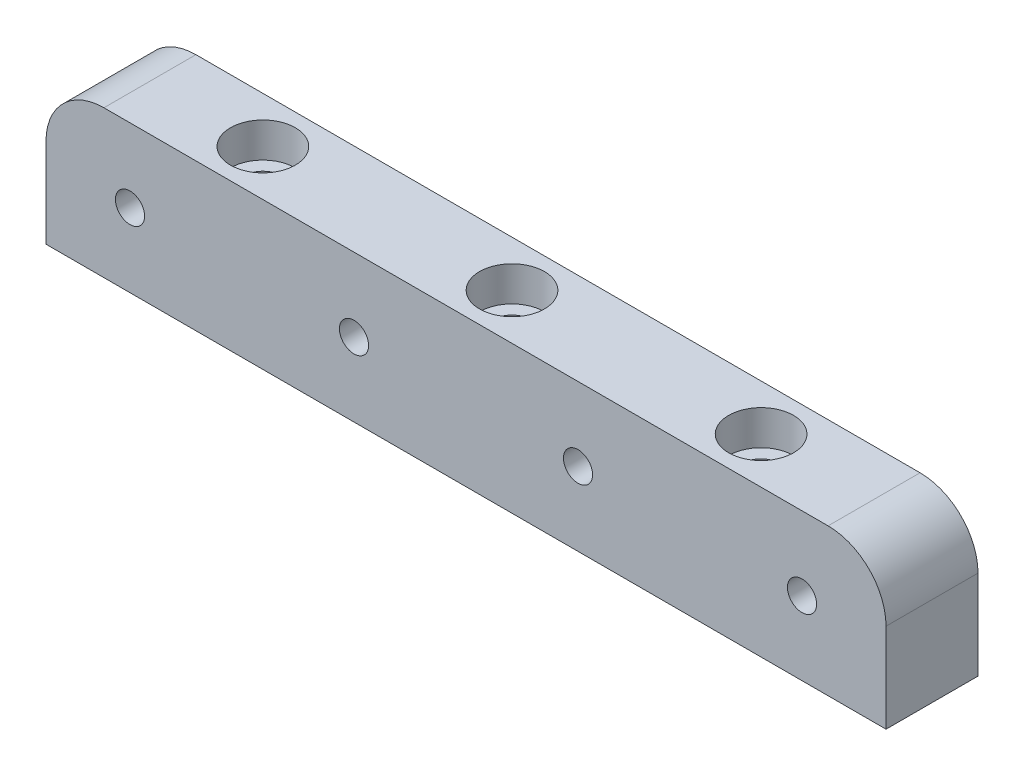
ISO-10303-21;
HEADER;
FILE_DESCRIPTION(('STEP AP214'),'2;1');
FILE_NAME('part.step','',(''),(''),'','','');
FILE_SCHEMA(('AUTOMOTIVE_DESIGN { 1 0 10303 214 1 1 1 1 }'));
ENDSEC;
DATA;
#1=APPLICATION_CONTEXT('core data for automotive mechanical design processes');
#2=APPLICATION_PROTOCOL_DEFINITION('international standard','automotive_design',2000,#1);
#3=PRODUCT_CONTEXT('',#1,'mechanical');
#4=PRODUCT('Part','Part','',(#3));
#5=PRODUCT_RELATED_PRODUCT_CATEGORY('part','',(#4));
#6=PRODUCT_DEFINITION_FORMATION('','',#4);
#7=PRODUCT_DEFINITION_CONTEXT('part definition',#1,'design');
#8=PRODUCT_DEFINITION('design','',#6,#7);
#9=PRODUCT_DEFINITION_SHAPE('','',#8);
#10=(LENGTH_UNIT() NAMED_UNIT(*) SI_UNIT(.MILLI.,.METRE.));
#11=(NAMED_UNIT(*) PLANE_ANGLE_UNIT() SI_UNIT($,.RADIAN.));
#12=(NAMED_UNIT(*) SI_UNIT($,.STERADIAN.) SOLID_ANGLE_UNIT());
#13=UNCERTAINTY_MEASURE_WITH_UNIT(LENGTH_MEASURE(1.E-05),#10,'distance_accuracy_value','');
#14=(GEOMETRIC_REPRESENTATION_CONTEXT(3) GLOBAL_UNCERTAINTY_ASSIGNED_CONTEXT((#13)) GLOBAL_UNIT_ASSIGNED_CONTEXT((#10,
#11,#12)) REPRESENTATION_CONTEXT('',''));
#15=CARTESIAN_POINT('',(0.,0.,0.));
#16=DIRECTION('',(0.,0.,1.));
#17=DIRECTION('',(1.,0.,0.));
#18=AXIS2_PLACEMENT_3D('',#15,#16,#17);
#19=CARTESIAN_POINT('',(0.,160.205737679692,31.6012401673979));
#20=DIRECTION('',(1.,0.,0.));
#21=DIRECTION('',(0.,1.,0.));
#22=AXIS2_PLACEMENT_3D('',#19,#20,#21);
#23=PLANE('',#22);
#24=DIRECTION('',(0.,0.,1.));
#25=VECTOR('',#24,1.);
#26=CARTESIAN_POINT('',(0.,162.905737679692,27.6324901673979));
#27=LINE('',#26,#25);
#28=CARTESIAN_POINT('',(0.,162.905737679692,23.6637401673979));
#29=VERTEX_POINT('',#28);
#30=CARTESIAN_POINT('',(0.,162.905737679692,39.5387401673979));
#31=VERTEX_POINT('',#30);
#32=EDGE_CURVE('E184',#29,#31,#27,.T.);
#33=ORIENTED_EDGE('',*,*,#32,.F.);
#34=DIRECTION('',(0.,-1.,0.));
#35=VECTOR('',#34,1.);
#36=CARTESIAN_POINT('',(0.,172.905737679692,23.6637401673979));
#37=LINE('',#36,#35);
#38=CARTESIAN_POINT('',(0.,147.505737679692,23.6637401673979));
#39=VERTEX_POINT('',#38);
#40=EDGE_CURVE('E11',#29,#39,#37,.T.);
#41=ORIENTED_EDGE('',*,*,#40,.T.);
#42=DIRECTION('',(0.,0.,1.));
#43=VECTOR('',#42,1.);
#44=CARTESIAN_POINT('',(0.,147.505737679692,23.6637401673979));
#45=LINE('',#44,#43);
#46=CARTESIAN_POINT('',(0.,147.505737679692,39.5387401673979));
#47=VERTEX_POINT('',#46);
#48=EDGE_CURVE('E112',#39,#47,#45,.T.);
#49=ORIENTED_EDGE('',*,*,#48,.T.);
#50=DIRECTION('',(0.,1.,0.));
#51=VECTOR('',#50,1.);
#52=CARTESIAN_POINT('',(0.,147.505737679692,39.5387401673979));
#53=LINE('',#52,#51);
#54=EDGE_CURVE('E105',#47,#31,#53,.T.);
#55=ORIENTED_EDGE('',*,*,#54,.T.);
#56=EDGE_LOOP('',(#33,#41,#49,#55));
#57=FACE_BOUND('',#56,.T.);
#58=ADVANCED_FACE('F17',(#57),#23,.F.);
#59=CARTESIAN_POINT('',(0.,147.505737679692,23.6637401673979));
#60=DIRECTION('',(0.,0.,-1.));
#61=DIRECTION('',(0.,-1.,0.));
#62=AXIS2_PLACEMENT_3D('',#59,#60,#61);
#63=PLANE('',#62);
#64=CARTESIAN_POINT('',(130.5,160.205737679692,23.6637401673979));
#65=DIRECTION('',(0.,0.,1.));
#66=DIRECTION('',(1.,0.,0.));
#67=AXIS2_PLACEMENT_3D('',#64,#65,#66);
#68=CIRCLE('',#67,2.5175);
#69=CARTESIAN_POINT('',(127.9825,160.205737679692,23.6637401673979));
#70=VERTEX_POINT('',#69);
#71=EDGE_CURVE('E316',#70,#70,#68,.T.);
#72=ORIENTED_EDGE('',*,*,#71,.T.);
#73=EDGE_LOOP('',(#72));
#74=FACE_BOUND('',#73,.T.);
#75=CARTESIAN_POINT('',(91.8333333333333,160.205737679692,23.6637401673979));
#76=DIRECTION('',(0.,0.,1.));
#77=DIRECTION('',(1.,0.,0.));
#78=AXIS2_PLACEMENT_3D('',#75,#76,#77);
#79=CIRCLE('',#78,2.5175);
#80=CARTESIAN_POINT('',(89.3158333333333,160.205737679692,23.6637401673979));
#81=VERTEX_POINT('',#80);
#82=EDGE_CURVE('E338',#81,#81,#79,.T.);
#83=ORIENTED_EDGE('',*,*,#82,.T.);
#84=EDGE_LOOP('',(#83));
#85=FACE_BOUND('',#84,.T.);
#86=CARTESIAN_POINT('',(53.1666666666667,160.205737679692,23.6637401673979));
#87=DIRECTION('',(0.,0.,1.));
#88=DIRECTION('',(1.,0.,0.));
#89=AXIS2_PLACEMENT_3D('',#86,#87,#88);
#90=CIRCLE('',#89,2.5175);
#91=CARTESIAN_POINT('',(50.6491666666667,160.205737679692,23.6637401673979));
#92=VERTEX_POINT('',#91);
#93=EDGE_CURVE('E362',#92,#92,#90,.T.);
#94=ORIENTED_EDGE('',*,*,#93,.T.);
#95=EDGE_LOOP('',(#94));
#96=FACE_BOUND('',#95,.T.);
#97=CARTESIAN_POINT('',(14.5,160.205737679692,23.6637401673979));
#98=DIRECTION('',(0.,0.,1.));
#99=DIRECTION('',(1.,0.,0.));
#100=AXIS2_PLACEMENT_3D('',#97,#98,#99);
#101=CIRCLE('',#100,2.5175);
#102=CARTESIAN_POINT('',(11.9825,160.205737679692,23.6637401673979));
#103=VERTEX_POINT('',#102);
#104=EDGE_CURVE('E381',#103,#103,#101,.T.);
#105=ORIENTED_EDGE('',*,*,#104,.T.);
#106=EDGE_LOOP('',(#105));
#107=FACE_BOUND('',#106,.T.);
#108=CARTESIAN_POINT('',(10.,162.905737679692,23.6637401673979));
#109=DIRECTION('',(0.,0.,1.));
#110=DIRECTION('',(-0.707106781186548,0.707106781186548,0.));
#111=AXIS2_PLACEMENT_3D('',#108,#109,#110);
#112=CIRCLE('',#111,10.);
#113=CARTESIAN_POINT('',(10.,172.905737679692,23.6637401673979));
#114=VERTEX_POINT('',#113);
#115=EDGE_CURVE('E195',#114,#29,#112,.T.);
#116=ORIENTED_EDGE('',*,*,#115,.F.);
#117=DIRECTION('',(1.,0.,0.));
#118=VECTOR('',#117,1.);
#119=CARTESIAN_POINT('',(0.,172.905737679692,23.6637401673979));
#120=LINE('',#119,#118);
#121=CARTESIAN_POINT('',(135.,172.905737679692,23.6637401673979));
#122=VERTEX_POINT('',#121);
#123=EDGE_CURVE('E152',#114,#122,#120,.T.);
#124=ORIENTED_EDGE('',*,*,#123,.T.);
#125=CARTESIAN_POINT('',(135.,162.905737679692,23.6637401673979));
#126=DIRECTION('',(0.,0.,1.));
#127=DIRECTION('',(0.707106781186548,0.707106781186548,0.));
#128=AXIS2_PLACEMENT_3D('',#125,#126,#127);
#129=CIRCLE('',#128,10.);
#130=CARTESIAN_POINT('',(145.,162.905737679692,23.6637401673979));
#131=VERTEX_POINT('',#130);
#132=EDGE_CURVE('E80',#131,#122,#129,.T.);
#133=ORIENTED_EDGE('',*,*,#132,.F.);
#134=DIRECTION('',(0.,1.,0.));
#135=VECTOR('',#134,1.);
#136=CARTESIAN_POINT('',(145.,172.905737679692,23.6637401673979));
#137=LINE('',#136,#135);
#138=CARTESIAN_POINT('',(145.,147.505737679692,23.6637401673979));
#139=VERTEX_POINT('',#138);
#140=EDGE_CURVE('E71',#139,#131,#137,.T.);
#141=ORIENTED_EDGE('',*,*,#140,.F.);
#142=DIRECTION('',(1.,0.,0.));
#143=VECTOR('',#142,1.);
#144=CARTESIAN_POINT('',(0.,147.505737679692,23.6637401673979));
#145=LINE('',#144,#143);
#146=EDGE_CURVE('E25',#39,#139,#145,.T.);
#147=ORIENTED_EDGE('',*,*,#146,.F.);
#148=ORIENTED_EDGE('',*,*,#40,.F.);
#149=EDGE_LOOP('',(#116,#124,#133,#141,#147,#148));
#150=FACE_BOUND('',#149,.T.);
#151=ADVANCED_FACE('F447',(#74,#85,#96,#107,#150),#63,.T.);
#152=CARTESIAN_POINT('',(0.,147.505737679692,39.5387401673979));
#153=DIRECTION('',(0.,-1.,0.));
#154=DIRECTION('',(0.,0.,-1.));
#155=AXIS2_PLACEMENT_3D('',#152,#153,#154);
#156=PLANE('',#155);
#157=CARTESIAN_POINT('',(72.5,147.505737679692,31.6012401673979));
#158=DIRECTION('',(0.,1.,0.));
#159=DIRECTION('',(0.,0.,1.));
#160=AXIS2_PLACEMENT_3D('',#157,#158,#159);
#161=CIRCLE('',#160,3.25);
#162=CARTESIAN_POINT('',(72.5,147.505737679692,28.3512401673979));
#163=VERTEX_POINT('',#162);
#164=EDGE_CURVE('E200',#163,#163,#161,.T.);
#165=ORIENTED_EDGE('',*,*,#164,.T.);
#166=EDGE_LOOP('',(#165));
#167=FACE_BOUND('',#166,.T.);
#168=CARTESIAN_POINT('',(29.5,147.505737679692,31.6012401673979));
#169=DIRECTION('',(0.,1.,0.));
#170=DIRECTION('',(0.,0.,1.));
#171=AXIS2_PLACEMENT_3D('',#168,#169,#170);
#172=CIRCLE('',#171,3.25);
#173=CARTESIAN_POINT('',(29.5,147.505737679692,28.3512401673979));
#174=VERTEX_POINT('',#173);
#175=EDGE_CURVE('E241',#174,#174,#172,.T.);
#176=ORIENTED_EDGE('',*,*,#175,.T.);
#177=EDGE_LOOP('',(#176));
#178=FACE_BOUND('',#177,.T.);
#179=CARTESIAN_POINT('',(115.5,147.505737679692,31.6012401673979));
#180=DIRECTION('',(0.,1.,0.));
#181=DIRECTION('',(0.,0.,1.));
#182=AXIS2_PLACEMENT_3D('',#179,#180,#181);
#183=CIRCLE('',#182,3.25);
#184=CARTESIAN_POINT('',(115.5,147.505737679692,28.3512401673979));
#185=VERTEX_POINT('',#184);
#186=EDGE_CURVE('E279',#185,#185,#183,.T.);
#187=ORIENTED_EDGE('',*,*,#186,.T.);
#188=EDGE_LOOP('',(#187));
#189=FACE_BOUND('',#188,.T.);
#190=ORIENTED_EDGE('',*,*,#48,.F.);
#191=ORIENTED_EDGE('',*,*,#146,.T.);
#192=DIRECTION('',(0.,0.,-1.));
#193=VECTOR('',#192,1.);
#194=CARTESIAN_POINT('',(145.,147.505737679692,23.6637401673979));
#195=LINE('',#194,#193);
#196=CARTESIAN_POINT('',(145.,147.505737679692,39.5387401673979));
#197=VERTEX_POINT('',#196);
#198=EDGE_CURVE('E107',#197,#139,#195,.T.);
#199=ORIENTED_EDGE('',*,*,#198,.F.);
#200=DIRECTION('',(1.,0.,0.));
#201=VECTOR('',#200,1.);
#202=CARTESIAN_POINT('',(0.,147.505737679692,39.5387401673979));
#203=LINE('',#202,#201);
#204=EDGE_CURVE('E92',#47,#197,#203,.T.);
#205=ORIENTED_EDGE('',*,*,#204,.F.);
#206=EDGE_LOOP('',(#190,#191,#199,#205));
#207=FACE_BOUND('',#206,.T.);
#208=ADVANCED_FACE('F455',(#167,#178,#189,#207),#156,.T.);
#209=CARTESIAN_POINT('',(145.,160.205737679692,31.6012401673979));
#210=DIRECTION('',(1.,0.,0.));
#211=DIRECTION('',(0.,1.,0.));
#212=AXIS2_PLACEMENT_3D('',#209,#210,#211);
#213=PLANE('',#212);
#214=DIRECTION('',(0.,0.,-1.));
#215=VECTOR('',#214,1.);
#216=CARTESIAN_POINT('',(145.,162.905737679692,27.6324901673979));
#217=LINE('',#216,#215);
#218=CARTESIAN_POINT('',(145.,162.905737679692,39.5387401673979));
#219=VERTEX_POINT('',#218);
#220=EDGE_CURVE('E65',#219,#131,#217,.T.);
#221=ORIENTED_EDGE('',*,*,#220,.F.);
#222=DIRECTION('',(0.,-1.,0.));
#223=VECTOR('',#222,1.);
#224=CARTESIAN_POINT('',(145.,147.505737679692,39.5387401673979));
#225=LINE('',#224,#223);
#226=EDGE_CURVE('E69',#219,#197,#225,.T.);
#227=ORIENTED_EDGE('',*,*,#226,.T.);
#228=ORIENTED_EDGE('',*,*,#198,.T.);
#229=ORIENTED_EDGE('',*,*,#140,.T.);
#230=EDGE_LOOP('',(#221,#227,#228,#229));
#231=FACE_BOUND('',#230,.T.);
#232=ADVANCED_FACE('F70',(#231),#213,.T.);
#233=CARTESIAN_POINT('',(135.,162.905737679692,27.6324901673979));
#234=DIRECTION('',(0.,0.,1.));
#235=DIRECTION('',(0.707106781186548,0.707106781186548,0.));
#236=AXIS2_PLACEMENT_3D('',#233,#234,#235);
#237=CYLINDRICAL_SURFACE('',#236,10.);
#238=CARTESIAN_POINT('',(135.,162.905737679692,39.5387401673979));
#239=DIRECTION('',(0.,0.,-1.));
#240=DIRECTION('',(0.707106781186548,0.707106781186548,0.));
#241=AXIS2_PLACEMENT_3D('',#238,#239,#240);
#242=CIRCLE('',#241,10.);
#243=CARTESIAN_POINT('',(135.,172.905737679692,39.5387401673979));
#244=VERTEX_POINT('',#243);
#245=EDGE_CURVE('E77',#244,#219,#242,.T.);
#246=ORIENTED_EDGE('',*,*,#245,.T.);
#247=ORIENTED_EDGE('',*,*,#220,.T.);
#248=ORIENTED_EDGE('',*,*,#132,.T.);
#249=DIRECTION('',(0.,0.,1.));
#250=VECTOR('',#249,1.);
#251=CARTESIAN_POINT('',(135.,172.905737679692,27.6324901673979));
#252=LINE('',#251,#250);
#253=EDGE_CURVE('E84',#122,#244,#252,.T.);
#254=ORIENTED_EDGE('',*,*,#253,.T.);
#255=EDGE_LOOP('',(#246,#247,#248,#254));
#256=FACE_BOUND('',#255,.T.);
#257=ADVANCED_FACE('F85',(#256),#237,.T.);
#258=CARTESIAN_POINT('',(0.,172.905737679692,39.5387401673979));
#259=DIRECTION('',(0.,0.,1.));
#260=DIRECTION('',(1.,0.,0.));
#261=AXIS2_PLACEMENT_3D('',#258,#259,#260);
#262=PLANE('',#261);
#263=CARTESIAN_POINT('',(130.5,160.205737679692,39.5387401673979));
#264=DIRECTION('',(0.,0.,-1.));
#265=DIRECTION('',(1.,0.,0.));
#266=AXIS2_PLACEMENT_3D('',#263,#264,#265);
#267=CIRCLE('',#266,2.5175);
#268=CARTESIAN_POINT('',(127.9825,160.205737679692,39.5387401673979));
#269=VERTEX_POINT('',#268);
#270=EDGE_CURVE('E335',#269,#269,#267,.T.);
#271=ORIENTED_EDGE('',*,*,#270,.T.);
#272=EDGE_LOOP('',(#271));
#273=FACE_BOUND('',#272,.T.);
#274=CARTESIAN_POINT('',(91.8333333333333,160.205737679692,39.5387401673979));
#275=DIRECTION('',(0.,0.,-1.));
#276=DIRECTION('',(1.,0.,0.));
#277=AXIS2_PLACEMENT_3D('',#274,#275,#276);
#278=CIRCLE('',#277,2.5175);
#279=CARTESIAN_POINT('',(89.3158333333333,160.205737679692,39.5387401673979));
#280=VERTEX_POINT('',#279);
#281=EDGE_CURVE('E354',#280,#280,#278,.T.);
#282=ORIENTED_EDGE('',*,*,#281,.T.);
#283=EDGE_LOOP('',(#282));
#284=FACE_BOUND('',#283,.T.);
#285=CARTESIAN_POINT('',(53.1666666666667,160.205737679692,39.5387401673979));
#286=DIRECTION('',(0.,0.,-1.));
#287=DIRECTION('',(1.,0.,0.));
#288=AXIS2_PLACEMENT_3D('',#285,#286,#287);
#289=CIRCLE('',#288,2.5175);
#290=CARTESIAN_POINT('',(50.6491666666667,160.205737679692,39.5387401673979));
#291=VERTEX_POINT('',#290);
#292=EDGE_CURVE('E374',#291,#291,#289,.T.);
#293=ORIENTED_EDGE('',*,*,#292,.T.);
#294=EDGE_LOOP('',(#293));
#295=FACE_BOUND('',#294,.T.);
#296=CARTESIAN_POINT('',(14.5,160.205737679692,39.5387401673979));
#297=DIRECTION('',(0.,0.,-1.));
#298=DIRECTION('',(1.,0.,0.));
#299=AXIS2_PLACEMENT_3D('',#296,#297,#298);
#300=CIRCLE('',#299,2.5175);
#301=CARTESIAN_POINT('',(11.9825,160.205737679692,39.5387401673979));
#302=VERTEX_POINT('',#301);
#303=EDGE_CURVE('E394',#302,#302,#300,.T.);
#304=ORIENTED_EDGE('',*,*,#303,.T.);
#305=EDGE_LOOP('',(#304));
#306=FACE_BOUND('',#305,.T.);
#307=CARTESIAN_POINT('',(10.,162.905737679692,39.5387401673979));
#308=DIRECTION('',(0.,0.,-1.));
#309=DIRECTION('',(-0.707106781186548,0.707106781186548,0.));
#310=AXIS2_PLACEMENT_3D('',#307,#308,#309);
#311=CIRCLE('',#310,10.);
#312=CARTESIAN_POINT('',(10.,172.905737679692,39.5387401673979));
#313=VERTEX_POINT('',#312);
#314=EDGE_CURVE('E178',#31,#313,#311,.T.);
#315=ORIENTED_EDGE('',*,*,#314,.F.);
#316=ORIENTED_EDGE('',*,*,#54,.F.);
#317=ORIENTED_EDGE('',*,*,#204,.T.);
#318=ORIENTED_EDGE('',*,*,#226,.F.);
#319=ORIENTED_EDGE('',*,*,#245,.F.);
#320=DIRECTION('',(1.,0.,0.));
#321=VECTOR('',#320,1.);
#322=CARTESIAN_POINT('',(0.,172.905737679692,39.5387401673979));
#323=LINE('',#322,#321);
#324=EDGE_CURVE('E164',#313,#244,#323,.T.);
#325=ORIENTED_EDGE('',*,*,#324,.F.);
#326=EDGE_LOOP('',(#315,#316,#317,#318,#319,#325));
#327=FACE_BOUND('',#326,.T.);
#328=ADVANCED_FACE('F95',(#273,#284,#295,#306,#327),#262,.T.);
#329=CARTESIAN_POINT('',(0.,172.905737679692,23.6637401673979));
#330=DIRECTION('',(0.,1.,0.));
#331=DIRECTION('',(1.,0.,0.));
#332=AXIS2_PLACEMENT_3D('',#329,#330,#331);
#333=PLANE('',#332);
#334=CARTESIAN_POINT('',(72.5,172.905737679692,31.6012401673979));
#335=DIRECTION('',(0.,-1.,0.));
#336=DIRECTION('',(0.,0.,1.));
#337=AXIS2_PLACEMENT_3D('',#334,#335,#336);
#338=CIRCLE('',#337,5.6);
#339=CARTESIAN_POINT('',(72.5,172.905737679692,26.0012401673979));
#340=VERTEX_POINT('',#339);
#341=EDGE_CURVE('E219',#340,#340,#338,.T.);
#342=ORIENTED_EDGE('',*,*,#341,.T.);
#343=EDGE_LOOP('',(#342));
#344=FACE_BOUND('',#343,.T.);
#345=CARTESIAN_POINT('',(29.5,172.905737679692,31.6012401673979));
#346=DIRECTION('',(0.,-1.,0.));
#347=DIRECTION('',(0.,0.,1.));
#348=AXIS2_PLACEMENT_3D('',#345,#346,#347);
#349=CIRCLE('',#348,5.6);
#350=CARTESIAN_POINT('',(29.5,172.905737679692,26.0012401673979));
#351=VERTEX_POINT('',#350);
#352=EDGE_CURVE('E259',#351,#351,#349,.T.);
#353=ORIENTED_EDGE('',*,*,#352,.T.);
#354=EDGE_LOOP('',(#353));
#355=FACE_BOUND('',#354,.T.);
#356=CARTESIAN_POINT('',(115.5,172.905737679692,31.6012401673979));
#357=DIRECTION('',(0.,-1.,0.));
#358=DIRECTION('',(0.,0.,1.));
#359=AXIS2_PLACEMENT_3D('',#356,#357,#358);
#360=CIRCLE('',#359,5.6);
#361=CARTESIAN_POINT('',(115.5,172.905737679692,26.0012401673979));
#362=VERTEX_POINT('',#361);
#363=EDGE_CURVE('E297',#362,#362,#360,.T.);
#364=ORIENTED_EDGE('',*,*,#363,.T.);
#365=EDGE_LOOP('',(#364));
#366=FACE_BOUND('',#365,.T.);
#367=DIRECTION('',(0.,0.,-1.));
#368=VECTOR('',#367,1.);
#369=CARTESIAN_POINT('',(10.,172.905737679692,27.6324901673979));
#370=LINE('',#369,#368);
#371=EDGE_CURVE('E171',#313,#114,#370,.T.);
#372=ORIENTED_EDGE('',*,*,#371,.F.);
#373=ORIENTED_EDGE('',*,*,#324,.T.);
#374=ORIENTED_EDGE('',*,*,#253,.F.);
#375=ORIENTED_EDGE('',*,*,#123,.F.);
#376=EDGE_LOOP('',(#372,#373,#374,#375));
#377=FACE_BOUND('',#376,.T.);
#378=ADVANCED_FACE('F412',(#344,#355,#366,#377),#333,.T.);
#379=CARTESIAN_POINT('',(10.,162.905737679692,27.6324901673979));
#380=DIRECTION('',(0.,0.,-1.));
#381=DIRECTION('',(-0.707106781186548,0.707106781186548,0.));
#382=AXIS2_PLACEMENT_3D('',#379,#380,#381);
#383=CYLINDRICAL_SURFACE('',#382,10.);
#384=ORIENTED_EDGE('',*,*,#115,.T.);
#385=ORIENTED_EDGE('',*,*,#32,.T.);
#386=ORIENTED_EDGE('',*,*,#314,.T.);
#387=ORIENTED_EDGE('',*,*,#371,.T.);
#388=EDGE_LOOP('',(#384,#385,#386,#387));
#389=FACE_BOUND('',#388,.T.);
#390=ADVANCED_FACE('F461',(#389),#383,.T.);
#391=CARTESIAN_POINT('',(72.5,160.205737679692,31.6012401673979));
#392=DIRECTION('',(0.,-1.,0.));
#393=DIRECTION('',(0.,0.,1.));
#394=AXIS2_PLACEMENT_3D('',#391,#392,#393);
#395=CYLINDRICAL_SURFACE('',#394,3.25);
#396=CARTESIAN_POINT('',(72.5,166.905737679692,31.6012401673979));
#397=DIRECTION('',(0.,-1.,0.));
#398=DIRECTION('',(0.,0.,1.));
#399=AXIS2_PLACEMENT_3D('',#396,#397,#398);
#400=CIRCLE('',#399,3.25);
#401=CARTESIAN_POINT('',(72.5,166.905737679692,28.3512401673979));
#402=VERTEX_POINT('',#401);
#403=EDGE_CURVE('E227',#402,#402,#400,.T.);
#404=ORIENTED_EDGE('',*,*,#403,.F.);
#405=DIRECTION('',(0.,-1.,0.));
#406=VECTOR('',#405,1.);
#407=CARTESIAN_POINT('',(72.5,160.205737679692,28.3512401673979));
#408=LINE('',#407,#406);
#409=EDGE_CURVE('E206',#402,#163,#408,.T.);
#410=ORIENTED_EDGE('',*,*,#409,.T.);
#411=ORIENTED_EDGE('',*,*,#164,.F.);
#412=ORIENTED_EDGE('',*,*,#409,.F.);
#413=EDGE_LOOP('',(#404,#410,#411,#412));
#414=FACE_BOUND('',#413,.T.);
#415=ADVANCED_FACE('F583',(#414),#395,.F.);
#416=CARTESIAN_POINT('',(72.5,169.905737679692,31.6012401673979));
#417=DIRECTION('',(0.,-1.,0.));
#418=DIRECTION('',(0.,0.,1.));
#419=AXIS2_PLACEMENT_3D('',#416,#417,#418);
#420=CYLINDRICAL_SURFACE('',#419,5.6);
#421=ORIENTED_EDGE('',*,*,#341,.F.);
#422=DIRECTION('',(0.,-1.,0.));
#423=VECTOR('',#422,1.);
#424=CARTESIAN_POINT('',(72.5,169.905737679692,26.0012401673979));
#425=LINE('',#424,#423);
#426=CARTESIAN_POINT('',(72.5,166.905737679692,26.0012401673979));
#427=VERTEX_POINT('',#426);
#428=EDGE_CURVE('E213',#340,#427,#425,.T.);
#429=ORIENTED_EDGE('',*,*,#428,.T.);
#430=CARTESIAN_POINT('',(72.5,166.905737679692,31.6012401673979));
#431=DIRECTION('',(0.,-1.,0.));
#432=DIRECTION('',(0.,0.,1.));
#433=AXIS2_PLACEMENT_3D('',#430,#431,#432);
#434=CIRCLE('',#433,5.6);
#435=EDGE_CURVE('E232',#427,#427,#434,.T.);
#436=ORIENTED_EDGE('',*,*,#435,.T.);
#437=ORIENTED_EDGE('',*,*,#428,.F.);
#438=EDGE_LOOP('',(#421,#429,#436,#437));
#439=FACE_BOUND('',#438,.T.);
#440=ADVANCED_FACE('F581',(#439),#420,.F.);
#441=CARTESIAN_POINT('',(72.5,166.905737679692,31.6012401673979));
#442=DIRECTION('',(0.,-1.,0.));
#443=DIRECTION('',(0.,0.,-1.));
#444=AXIS2_PLACEMENT_3D('',#441,#442,#443);
#445=PLANE('',#444);
#446=ORIENTED_EDGE('',*,*,#403,.T.);
#447=EDGE_LOOP('',(#446));
#448=FACE_BOUND('',#447,.T.);
#449=ORIENTED_EDGE('',*,*,#435,.F.);
#450=EDGE_LOOP('',(#449));
#451=FACE_BOUND('',#450,.T.);
#452=ADVANCED_FACE('F589',(#448,#451),#445,.F.);
#453=CARTESIAN_POINT('',(29.5,160.205737679692,31.6012401673979));
#454=DIRECTION('',(0.,-1.,0.));
#455=DIRECTION('',(0.,0.,1.));
#456=AXIS2_PLACEMENT_3D('',#453,#454,#455);
#457=CYLINDRICAL_SURFACE('',#456,3.25);
#458=CARTESIAN_POINT('',(29.5,166.905737679692,31.6012401673979));
#459=DIRECTION('',(0.,-1.,0.));
#460=DIRECTION('',(0.,0.,1.));
#461=AXIS2_PLACEMENT_3D('',#458,#459,#460);
#462=CIRCLE('',#461,3.25);
#463=CARTESIAN_POINT('',(29.5,166.905737679692,28.3512401673979));
#464=VERTEX_POINT('',#463);
#465=EDGE_CURVE('E262',#464,#464,#462,.T.);
#466=ORIENTED_EDGE('',*,*,#465,.F.);
#467=DIRECTION('',(0.,-1.,0.));
#468=VECTOR('',#467,1.);
#469=CARTESIAN_POINT('',(29.5,160.205737679692,28.3512401673979));
#470=LINE('',#469,#468);
#471=EDGE_CURVE('E248',#464,#174,#470,.T.);
#472=ORIENTED_EDGE('',*,*,#471,.T.);
#473=ORIENTED_EDGE('',*,*,#175,.F.);
#474=ORIENTED_EDGE('',*,*,#471,.F.);
#475=EDGE_LOOP('',(#466,#472,#473,#474));
#476=FACE_BOUND('',#475,.T.);
#477=ADVANCED_FACE('F576',(#476),#457,.F.);
#478=CARTESIAN_POINT('',(29.5,169.905737679692,31.6012401673979));
#479=DIRECTION('',(0.,-1.,0.));
#480=DIRECTION('',(0.,0.,1.));
#481=AXIS2_PLACEMENT_3D('',#478,#479,#480);
#482=CYLINDRICAL_SURFACE('',#481,5.6);
#483=ORIENTED_EDGE('',*,*,#352,.F.);
#484=DIRECTION('',(0.,-1.,0.));
#485=VECTOR('',#484,1.);
#486=CARTESIAN_POINT('',(29.5,169.905737679692,26.0012401673979));
#487=LINE('',#486,#485);
#488=CARTESIAN_POINT('',(29.5,166.905737679692,26.0012401673979));
#489=VERTEX_POINT('',#488);
#490=EDGE_CURVE('E254',#351,#489,#487,.T.);
#491=ORIENTED_EDGE('',*,*,#490,.T.);
#492=CARTESIAN_POINT('',(29.5,166.905737679692,31.6012401673979));
#493=DIRECTION('',(0.,-1.,0.));
#494=DIRECTION('',(0.,0.,1.));
#495=AXIS2_PLACEMENT_3D('',#492,#493,#494);
#496=CIRCLE('',#495,5.6);
#497=EDGE_CURVE('E271',#489,#489,#496,.T.);
#498=ORIENTED_EDGE('',*,*,#497,.T.);
#499=ORIENTED_EDGE('',*,*,#490,.F.);
#500=EDGE_LOOP('',(#483,#491,#498,#499));
#501=FACE_BOUND('',#500,.T.);
#502=ADVANCED_FACE('F575',(#501),#482,.F.);
#503=CARTESIAN_POINT('',(29.5,166.905737679692,31.6012401673979));
#504=DIRECTION('',(0.,-1.,0.));
#505=DIRECTION('',(0.,0.,-1.));
#506=AXIS2_PLACEMENT_3D('',#503,#504,#505);
#507=PLANE('',#506);
#508=ORIENTED_EDGE('',*,*,#465,.T.);
#509=EDGE_LOOP('',(#508));
#510=FACE_BOUND('',#509,.T.);
#511=ORIENTED_EDGE('',*,*,#497,.F.);
#512=EDGE_LOOP('',(#511));
#513=FACE_BOUND('',#512,.T.);
#514=ADVANCED_FACE('F574',(#510,#513),#507,.F.);
#515=CARTESIAN_POINT('',(115.5,160.205737679692,31.6012401673979));
#516=DIRECTION('',(0.,-1.,0.));
#517=DIRECTION('',(0.,0.,1.));
#518=AXIS2_PLACEMENT_3D('',#515,#516,#517);
#519=CYLINDRICAL_SURFACE('',#518,3.25);
#520=CARTESIAN_POINT('',(115.5,166.905737679692,31.6012401673979));
#521=DIRECTION('',(0.,-1.,0.));
#522=DIRECTION('',(0.,0.,1.));
#523=AXIS2_PLACEMENT_3D('',#520,#521,#522);
#524=CIRCLE('',#523,3.25);
#525=CARTESIAN_POINT('',(115.5,166.905737679692,28.3512401673979));
#526=VERTEX_POINT('',#525);
#527=EDGE_CURVE('E305',#526,#526,#524,.T.);
#528=ORIENTED_EDGE('',*,*,#527,.F.);
#529=DIRECTION('',(0.,-1.,0.));
#530=VECTOR('',#529,1.);
#531=CARTESIAN_POINT('',(115.5,160.205737679692,28.3512401673979));
#532=LINE('',#531,#530);
#533=EDGE_CURVE('E285',#526,#185,#532,.T.);
#534=ORIENTED_EDGE('',*,*,#533,.T.);
#535=ORIENTED_EDGE('',*,*,#186,.F.);
#536=ORIENTED_EDGE('',*,*,#533,.F.);
#537=EDGE_LOOP('',(#528,#534,#535,#536));
#538=FACE_BOUND('',#537,.T.);
#539=ADVANCED_FACE('F444',(#538),#519,.F.);
#540=CARTESIAN_POINT('',(115.5,169.905737679692,31.6012401673979));
#541=DIRECTION('',(0.,-1.,0.));
#542=DIRECTION('',(0.,0.,1.));
#543=AXIS2_PLACEMENT_3D('',#540,#541,#542);
#544=CYLINDRICAL_SURFACE('',#543,5.6);
#545=ORIENTED_EDGE('',*,*,#363,.F.);
#546=DIRECTION('',(0.,-1.,0.));
#547=VECTOR('',#546,1.);
#548=CARTESIAN_POINT('',(115.5,169.905737679692,26.0012401673979));
#549=LINE('',#548,#547);
#550=CARTESIAN_POINT('',(115.5,166.905737679692,26.0012401673979));
#551=VERTEX_POINT('',#550);
#552=EDGE_CURVE('E291',#362,#551,#549,.T.);
#553=ORIENTED_EDGE('',*,*,#552,.T.);
#554=CARTESIAN_POINT('',(115.5,166.905737679692,31.6012401673979));
#555=DIRECTION('',(0.,-1.,0.));
#556=DIRECTION('',(0.,0.,1.));
#557=AXIS2_PLACEMENT_3D('',#554,#555,#556);
#558=CIRCLE('',#557,5.6);
#559=EDGE_CURVE('E308',#551,#551,#558,.T.);
#560=ORIENTED_EDGE('',*,*,#559,.T.);
#561=ORIENTED_EDGE('',*,*,#552,.F.);
#562=EDGE_LOOP('',(#545,#553,#560,#561));
#563=FACE_BOUND('',#562,.T.);
#564=ADVANCED_FACE('F425',(#563),#544,.F.);
#565=CARTESIAN_POINT('',(115.5,166.905737679692,31.6012401673979));
#566=DIRECTION('',(0.,-1.,0.));
#567=DIRECTION('',(0.,0.,-1.));
#568=AXIS2_PLACEMENT_3D('',#565,#566,#567);
#569=PLANE('',#568);
#570=ORIENTED_EDGE('',*,*,#527,.T.);
#571=EDGE_LOOP('',(#570));
#572=FACE_BOUND('',#571,.T.);
#573=ORIENTED_EDGE('',*,*,#559,.F.);
#574=EDGE_LOOP('',(#573));
#575=FACE_BOUND('',#574,.T.);
#576=ADVANCED_FACE('F427',(#572,#575),#569,.F.);
#577=CARTESIAN_POINT('',(130.5,160.205737679692,31.6012401673979));
#578=DIRECTION('',(0.,0.,-1.));
#579=DIRECTION('',(1.,0.,0.));
#580=AXIS2_PLACEMENT_3D('',#577,#578,#579);
#581=CYLINDRICAL_SURFACE('',#580,2.5175);
#582=ORIENTED_EDGE('',*,*,#270,.F.);
#583=DIRECTION('',(0.,0.,-1.));
#584=VECTOR('',#583,1.);
#585=CARTESIAN_POINT('',(127.9825,160.205737679692,31.6012401673979));
#586=LINE('',#585,#584);
#587=EDGE_CURVE('E324',#269,#70,#586,.T.);
#588=ORIENTED_EDGE('',*,*,#587,.T.);
#589=ORIENTED_EDGE('',*,*,#71,.F.);
#590=ORIENTED_EDGE('',*,*,#587,.F.);
#591=EDGE_LOOP('',(#582,#588,#589,#590));
#592=FACE_BOUND('',#591,.T.);
#593=ADVANCED_FACE('F431',(#592),#581,.F.);
#594=CARTESIAN_POINT('',(91.8333333333333,160.205737679692,31.6012401673979));
#595=DIRECTION('',(0.,0.,-1.));
#596=DIRECTION('',(1.,0.,0.));
#597=AXIS2_PLACEMENT_3D('',#594,#595,#596);
#598=CYLINDRICAL_SURFACE('',#597,2.5175);
#599=ORIENTED_EDGE('',*,*,#281,.F.);
#600=DIRECTION('',(0.,0.,-1.));
#601=VECTOR('',#600,1.);
#602=CARTESIAN_POINT('',(89.3158333333333,160.205737679692,31.6012401673979));
#603=LINE('',#602,#601);
#604=EDGE_CURVE('E350',#280,#81,#603,.T.);
#605=ORIENTED_EDGE('',*,*,#604,.T.);
#606=ORIENTED_EDGE('',*,*,#82,.F.);
#607=ORIENTED_EDGE('',*,*,#604,.F.);
#608=EDGE_LOOP('',(#599,#605,#606,#607));
#609=FACE_BOUND('',#608,.T.);
#610=ADVANCED_FACE('F439',(#609),#598,.F.);
#611=CARTESIAN_POINT('',(53.1666666666667,160.205737679692,31.6012401673979));
#612=DIRECTION('',(0.,0.,-1.));
#613=DIRECTION('',(1.,0.,0.));
#614=AXIS2_PLACEMENT_3D('',#611,#612,#613);
#615=CYLINDRICAL_SURFACE('',#614,2.5175);
#616=ORIENTED_EDGE('',*,*,#292,.F.);
#617=DIRECTION('',(0.,0.,-1.));
#618=VECTOR('',#617,1.);
#619=CARTESIAN_POINT('',(50.6491666666667,160.205737679692,31.6012401673979));
#620=LINE('',#619,#618);
#621=EDGE_CURVE('E366',#291,#92,#620,.T.);
#622=ORIENTED_EDGE('',*,*,#621,.T.);
#623=ORIENTED_EDGE('',*,*,#93,.F.);
#624=ORIENTED_EDGE('',*,*,#621,.F.);
#625=EDGE_LOOP('',(#616,#622,#623,#624));
#626=FACE_BOUND('',#625,.T.);
#627=ADVANCED_FACE('F571',(#626),#615,.F.);
#628=CARTESIAN_POINT('',(14.5,160.205737679692,31.6012401673979));
#629=DIRECTION('',(0.,0.,-1.));
#630=DIRECTION('',(1.,0.,0.));
#631=AXIS2_PLACEMENT_3D('',#628,#629,#630);
#632=CYLINDRICAL_SURFACE('',#631,2.5175);
#633=ORIENTED_EDGE('',*,*,#303,.F.);
#634=DIRECTION('',(0.,0.,-1.));
#635=VECTOR('',#634,1.);
#636=CARTESIAN_POINT('',(11.9825,160.205737679692,31.6012401673979));
#637=LINE('',#636,#635);
#638=EDGE_CURVE('E390',#302,#103,#637,.T.);
#639=ORIENTED_EDGE('',*,*,#638,.T.);
#640=ORIENTED_EDGE('',*,*,#104,.F.);
#641=ORIENTED_EDGE('',*,*,#638,.F.);
#642=EDGE_LOOP('',(#633,#639,#640,#641));
#643=FACE_BOUND('',#642,.T.);
#644=ADVANCED_FACE('F551',(#643),#632,.F.);
#645=CLOSED_SHELL('',(#58,#151,#208,#232,#257,#328,#378,#390,#415,#440,#452,#477,#502,#514,#539,
#564,#576,#593,#610,#627,#644));
#646=MANIFOLD_SOLID_BREP('B1',#645);
#647=ADVANCED_BREP_SHAPE_REPRESENTATION('',(#18,#646),#14);
#648=SHAPE_DEFINITION_REPRESENTATION(#9,#647);
ENDSEC;
END-ISO-10303-21;
